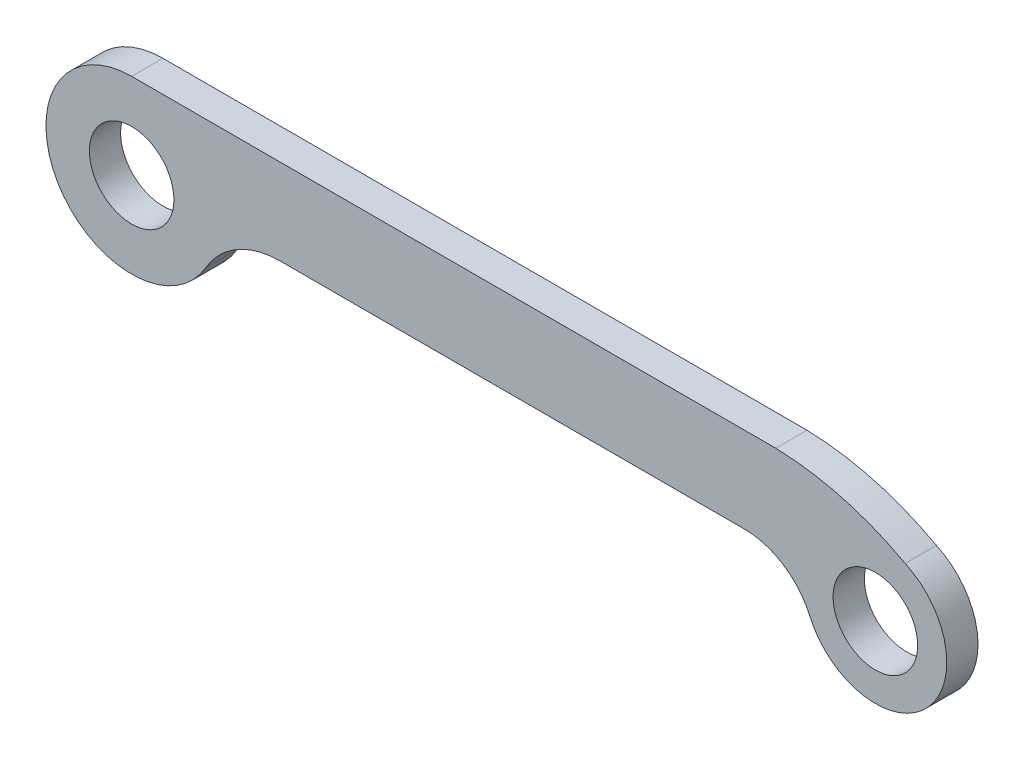
ISO-10303-21;
HEADER;
FILE_DESCRIPTION(('STEP AP214'),'2;1');
FILE_NAME('part.step','',(''),(''),'','','');
FILE_SCHEMA(('AUTOMOTIVE_DESIGN { 1 0 10303 214 1 1 1 1 }'));
ENDSEC;
DATA;
#1=APPLICATION_CONTEXT('core data for automotive mechanical design processes');
#2=APPLICATION_PROTOCOL_DEFINITION('international standard','automotive_design',2000,#1);
#3=PRODUCT_CONTEXT('',#1,'mechanical');
#4=PRODUCT('Part','Part','',(#3));
#5=PRODUCT_RELATED_PRODUCT_CATEGORY('part','',(#4));
#6=PRODUCT_DEFINITION_FORMATION('','',#4);
#7=PRODUCT_DEFINITION_CONTEXT('part definition',#1,'design');
#8=PRODUCT_DEFINITION('design','',#6,#7);
#9=PRODUCT_DEFINITION_SHAPE('','',#8);
#10=(LENGTH_UNIT() NAMED_UNIT(*) SI_UNIT(.MILLI.,.METRE.));
#11=(NAMED_UNIT(*) PLANE_ANGLE_UNIT() SI_UNIT($,.RADIAN.));
#12=(NAMED_UNIT(*) SI_UNIT($,.STERADIAN.) SOLID_ANGLE_UNIT());
#13=UNCERTAINTY_MEASURE_WITH_UNIT(LENGTH_MEASURE(1.E-05),#10,'distance_accuracy_value','');
#14=(GEOMETRIC_REPRESENTATION_CONTEXT(3) GLOBAL_UNCERTAINTY_ASSIGNED_CONTEXT((#13)) GLOBAL_UNIT_ASSIGNED_CONTEXT((#10,
#11,#12)) REPRESENTATION_CONTEXT('',''));
#15=CARTESIAN_POINT('',(0.,0.,0.));
#16=DIRECTION('',(0.,0.,1.));
#17=DIRECTION('',(1.,0.,0.));
#18=AXIS2_PLACEMENT_3D('',#15,#16,#17);
#19=CARTESIAN_POINT('',(33.2553755053223,-19.2,7.));
#20=DIRECTION('',(0.,0.,-1.));
#21=DIRECTION('',(-1.,0.,0.));
#22=AXIS2_PLACEMENT_3D('',#19,#20,#21);
#23=CYLINDRICAL_SURFACE('',#22,19.2);
#24=CARTESIAN_POINT('',(33.2553755053223,-19.2,0.));
#25=DIRECTION('',(0.,0.,1.));
#26=DIRECTION('',(1.,0.,0.));
#27=AXIS2_PLACEMENT_3D('',#24,#25,#26);
#28=CIRCLE('',#27,19.2);
#29=CARTESIAN_POINT('',(33.2553755053223,0.,0.));
#30=VERTEX_POINT('',#29);
#31=CARTESIAN_POINT('',(16.6276877526612,-9.60000000000002,0.));
#32=VERTEX_POINT('',#31);
#33=EDGE_CURVE('E148',#30,#32,#28,.T.);
#34=ORIENTED_EDGE('',*,*,#33,.F.);
#35=DIRECTION('',(0.,0.,-1.));
#36=VECTOR('',#35,1.);
#37=CARTESIAN_POINT('',(33.2553755053223,0.,7.));
#38=LINE('',#37,#36);
#39=CARTESIAN_POINT('',(33.2553755053223,0.,7.));
#40=VERTEX_POINT('',#39);
#41=EDGE_CURVE('E11',#40,#30,#38,.T.);
#42=ORIENTED_EDGE('',*,*,#41,.F.);
#43=CARTESIAN_POINT('',(33.2553755053223,-19.2,7.));
#44=DIRECTION('',(0.,0.,1.));
#45=DIRECTION('',(1.,0.,0.));
#46=AXIS2_PLACEMENT_3D('',#43,#44,#45);
#47=CIRCLE('',#46,19.2);
#48=CARTESIAN_POINT('',(16.6276877526612,-9.60000000000002,7.));
#49=VERTEX_POINT('',#48);
#50=EDGE_CURVE('E177',#40,#49,#47,.T.);
#51=ORIENTED_EDGE('',*,*,#50,.T.);
#52=DIRECTION('',(0.,0.,-1.));
#53=VECTOR('',#52,1.);
#54=CARTESIAN_POINT('',(16.6276877526612,-9.60000000000002,7.));
#55=LINE('',#54,#53);
#56=EDGE_CURVE('E91',#49,#32,#55,.T.);
#57=ORIENTED_EDGE('',*,*,#56,.T.);
#58=EDGE_LOOP('',(#34,#42,#51,#57));
#59=FACE_BOUND('',#58,.T.);
#60=ADVANCED_FACE('F44',(#59),#23,.F.);
#61=CARTESIAN_POINT('',(0.,0.,7.));
#62=DIRECTION('',(0.,1.,0.));
#63=DIRECTION('',(-1.,0.,0.));
#64=AXIS2_PLACEMENT_3D('',#61,#62,#63);
#65=PLANE('',#64);
#66=DIRECTION('',(1.,0.,0.));
#67=VECTOR('',#66,1.);
#68=CARTESIAN_POINT('',(0.,0.,0.));
#69=LINE('',#68,#67);
#70=CARTESIAN_POINT('',(137.31626294448,0.,0.));
#71=VERTEX_POINT('',#70);
#72=EDGE_CURVE('E147',#30,#71,#69,.T.);
#73=ORIENTED_EDGE('',*,*,#72,.T.);
#74=DIRECTION('',(0.,0.,-1.));
#75=VECTOR('',#74,1.);
#76=CARTESIAN_POINT('',(137.31626294448,0.,7.));
#77=LINE('',#76,#75);
#78=CARTESIAN_POINT('',(137.31626294448,0.,7.));
#79=VERTEX_POINT('',#78);
#80=EDGE_CURVE('E53',#79,#71,#77,.T.);
#81=ORIENTED_EDGE('',*,*,#80,.F.);
#82=DIRECTION('',(1.,0.,0.));
#83=VECTOR('',#82,1.);
#84=CARTESIAN_POINT('',(0.,0.,7.));
#85=LINE('',#84,#83);
#86=EDGE_CURVE('E202',#40,#79,#85,.T.);
#87=ORIENTED_EDGE('',*,*,#86,.F.);
#88=ORIENTED_EDGE('',*,*,#41,.T.);
#89=EDGE_LOOP('',(#73,#81,#87,#88));
#90=FACE_BOUND('',#89,.T.);
#91=ADVANCED_FACE('F211',(#90),#65,.F.);
#92=CARTESIAN_POINT('',(137.31626294448,-16.,7.));
#93=DIRECTION('',(0.,0.,-1.));
#94=DIRECTION('',(-1.,0.,0.));
#95=AXIS2_PLACEMENT_3D('',#92,#93,#94);
#96=CYLINDRICAL_SURFACE('',#95,16.);
#97=CARTESIAN_POINT('',(137.31626294448,-16.,0.));
#98=DIRECTION('',(0.,0.,1.));
#99=DIRECTION('',(1.,0.,0.));
#100=AXIS2_PLACEMENT_3D('',#97,#98,#99);
#101=CIRCLE('',#100,16.);
#102=CARTESIAN_POINT('',(151.980376503408,-9.5997051996922,0.));
#103=VERTEX_POINT('',#102);
#104=EDGE_CURVE('E153',#71,#103,#101,.F.);
#105=ORIENTED_EDGE('',*,*,#104,.T.);
#106=DIRECTION('',(0.,0.,-1.));
#107=VECTOR('',#106,1.);
#108=CARTESIAN_POINT('',(151.980376503408,-9.5997051996922,7.));
#109=LINE('',#108,#107);
#110=CARTESIAN_POINT('',(151.980376503408,-9.5997051996922,7.));
#111=VERTEX_POINT('',#110);
#112=EDGE_CURVE('E181',#111,#103,#109,.T.);
#113=ORIENTED_EDGE('',*,*,#112,.F.);
#114=CARTESIAN_POINT('',(137.31626294448,-16.,7.));
#115=DIRECTION('',(0.,0.,1.));
#116=DIRECTION('',(1.,0.,0.));
#117=AXIS2_PLACEMENT_3D('',#114,#115,#116);
#118=CIRCLE('',#117,16.);
#119=EDGE_CURVE('E191',#79,#111,#118,.F.);
#120=ORIENTED_EDGE('',*,*,#119,.F.);
#121=ORIENTED_EDGE('',*,*,#80,.T.);
#122=EDGE_LOOP('',(#105,#113,#120,#121));
#123=FACE_BOUND('',#122,.T.);
#124=ADVANCED_FACE('F195',(#123),#96,.F.);
#125=CARTESIAN_POINT('',(166.644490062337,-3.19941039938443,7.));
#126=DIRECTION('',(0.,0.,-1.));
#127=DIRECTION('',(-1.,0.,0.));
#128=AXIS2_PLACEMENT_3D('',#125,#126,#127);
#129=CYLINDRICAL_SURFACE('',#128,16.);
#130=CARTESIAN_POINT('',(166.644490062337,-3.19941039938443,0.));
#131=DIRECTION('',(0.,0.,1.));
#132=DIRECTION('',(1.,0.,0.));
#133=AXIS2_PLACEMENT_3D('',#130,#131,#132);
#134=CIRCLE('',#133,16.);
#135=CARTESIAN_POINT('',(173.328738351677,11.3374676975956,0.));
#136=VERTEX_POINT('',#135);
#137=EDGE_CURVE('E156',#103,#136,#134,.T.);
#138=ORIENTED_EDGE('',*,*,#137,.T.);
#139=DIRECTION('',(0.,0.,-1.));
#140=VECTOR('',#139,1.);
#141=CARTESIAN_POINT('',(173.328738351677,11.3374676975956,7.));
#142=LINE('',#141,#140);
#143=CARTESIAN_POINT('',(173.328738351677,11.3374676975956,7.));
#144=VERTEX_POINT('',#143);
#145=EDGE_CURVE('E122',#144,#136,#142,.T.);
#146=ORIENTED_EDGE('',*,*,#145,.F.);
#147=CARTESIAN_POINT('',(166.644490062337,-3.19941039938443,7.));
#148=DIRECTION('',(0.,0.,1.));
#149=DIRECTION('',(1.,0.,0.));
#150=AXIS2_PLACEMENT_3D('',#147,#148,#149);
#151=CIRCLE('',#150,16.);
#152=EDGE_CURVE('E130',#111,#144,#151,.T.);
#153=ORIENTED_EDGE('',*,*,#152,.F.);
#154=ORIENTED_EDGE('',*,*,#112,.T.);
#155=EDGE_LOOP('',(#138,#146,#153,#154));
#156=FACE_BOUND('',#155,.T.);
#157=ADVANCED_FACE('F205',(#156),#129,.T.);
#158=CARTESIAN_POINT('',(142.532840486075,-44.8343295314916,7.));
#159=DIRECTION('',(0.,0.,-1.));
#160=DIRECTION('',(-1.,0.,0.));
#161=AXIS2_PLACEMENT_3D('',#158,#159,#160);
#162=CYLINDRICAL_SURFACE('',#161,64.0598011961814);
#163=CARTESIAN_POINT('',(142.532840486075,-44.8343295314916,0.));
#164=DIRECTION('',(0.,0.,1.));
#165=DIRECTION('',(1.,0.,0.));
#166=AXIS2_PLACEMENT_3D('',#163,#164,#165);
#167=CIRCLE('',#166,64.0598011961814);
#168=CARTESIAN_POINT('',(144.339154618949,19.2,0.));
#169=VERTEX_POINT('',#168);
#170=EDGE_CURVE('E113',#169,#136,#167,.F.);
#171=ORIENTED_EDGE('',*,*,#170,.F.);
#172=DIRECTION('',(0.,0.,-1.));
#173=VECTOR('',#172,1.);
#174=CARTESIAN_POINT('',(144.339154618949,19.2,7.));
#175=LINE('',#174,#173);
#176=CARTESIAN_POINT('',(144.339154618949,19.2,7.));
#177=VERTEX_POINT('',#176);
#178=EDGE_CURVE('E109',#177,#169,#175,.T.);
#179=ORIENTED_EDGE('',*,*,#178,.F.);
#180=CARTESIAN_POINT('',(142.532840486075,-44.8343295314916,7.));
#181=DIRECTION('',(0.,0.,1.));
#182=DIRECTION('',(1.,0.,0.));
#183=AXIS2_PLACEMENT_3D('',#180,#181,#182);
#184=CIRCLE('',#183,64.0598011961814);
#185=EDGE_CURVE('E114',#177,#144,#184,.F.);
#186=ORIENTED_EDGE('',*,*,#185,.T.);
#187=ORIENTED_EDGE('',*,*,#145,.T.);
#188=EDGE_LOOP('',(#171,#179,#186,#187));
#189=FACE_BOUND('',#188,.T.);
#190=ADVANCED_FACE('F115',(#189),#162,.T.);
#191=CARTESIAN_POINT('',(0.,19.2,7.));
#192=DIRECTION('',(0.,1.,0.));
#193=DIRECTION('',(-1.,0.,0.));
#194=AXIS2_PLACEMENT_3D('',#191,#192,#193);
#195=PLANE('',#194);
#196=DIRECTION('',(1.,0.,0.));
#197=VECTOR('',#196,1.);
#198=CARTESIAN_POINT('',(0.,19.2,0.));
#199=LINE('',#198,#197);
#200=CARTESIAN_POINT('',(0.,19.2,0.));
#201=VERTEX_POINT('',#200);
#202=EDGE_CURVE('E165',#201,#169,#199,.T.);
#203=ORIENTED_EDGE('',*,*,#202,.F.);
#204=DIRECTION('',(0.,0.,-1.));
#205=VECTOR('',#204,1.);
#206=CARTESIAN_POINT('',(0.,19.2,7.));
#207=LINE('',#206,#205);
#208=CARTESIAN_POINT('',(0.,19.2,7.));
#209=VERTEX_POINT('',#208);
#210=EDGE_CURVE('E88',#209,#201,#207,.T.);
#211=ORIENTED_EDGE('',*,*,#210,.F.);
#212=DIRECTION('',(1.,0.,0.));
#213=VECTOR('',#212,1.);
#214=CARTESIAN_POINT('',(0.,19.2,7.));
#215=LINE('',#214,#213);
#216=EDGE_CURVE('E123',#209,#177,#215,.T.);
#217=ORIENTED_EDGE('',*,*,#216,.T.);
#218=ORIENTED_EDGE('',*,*,#178,.T.);
#219=EDGE_LOOP('',(#203,#211,#217,#218));
#220=FACE_BOUND('',#219,.T.);
#221=ADVANCED_FACE('F134',(#220),#195,.T.);
#222=CARTESIAN_POINT('',(0.,0.,7.));
#223=DIRECTION('',(0.,0.,-1.));
#224=DIRECTION('',(-1.,0.,0.));
#225=AXIS2_PLACEMENT_3D('',#222,#223,#224);
#226=CYLINDRICAL_SURFACE('',#225,9.47199999999998);
#227=CARTESIAN_POINT('',(0.,0.,7.));
#228=DIRECTION('',(0.,0.,1.));
#229=DIRECTION('',(1.,0.,0.));
#230=AXIS2_PLACEMENT_3D('',#227,#228,#229);
#231=CIRCLE('',#230,9.47199999999998);
#232=CARTESIAN_POINT('',(9.47199999999998,0.,7.));
#233=VERTEX_POINT('',#232);
#234=EDGE_CURVE('E132',#233,#233,#231,.T.);
#235=ORIENTED_EDGE('',*,*,#234,.T.);
#236=EDGE_LOOP('',(#235));
#237=FACE_BOUND('',#236,.T.);
#238=CARTESIAN_POINT('',(0.,0.,0.));
#239=DIRECTION('',(0.,0.,1.));
#240=DIRECTION('',(1.,0.,0.));
#241=AXIS2_PLACEMENT_3D('',#238,#239,#240);
#242=CIRCLE('',#241,9.47199999999998);
#243=CARTESIAN_POINT('',(9.47199999999998,0.,0.));
#244=VERTEX_POINT('',#243);
#245=EDGE_CURVE('E169',#244,#244,#242,.T.);
#246=ORIENTED_EDGE('',*,*,#245,.F.);
#247=EDGE_LOOP('',(#246));
#248=FACE_BOUND('',#247,.T.);
#249=ADVANCED_FACE('F223',(#237,#248),#226,.F.);
#250=CARTESIAN_POINT('',(0.,0.,7.));
#251=DIRECTION('',(0.,0.,-1.));
#252=DIRECTION('',(-1.,0.,0.));
#253=AXIS2_PLACEMENT_3D('',#250,#251,#252);
#254=CYLINDRICAL_SURFACE('',#253,19.2);
#255=CARTESIAN_POINT('',(0.,0.,0.));
#256=DIRECTION('',(0.,0.,1.));
#257=DIRECTION('',(1.,0.,0.));
#258=AXIS2_PLACEMENT_3D('',#255,#256,#257);
#259=CIRCLE('',#258,19.2);
#260=EDGE_CURVE('E164',#201,#32,#259,.T.);
#261=ORIENTED_EDGE('',*,*,#260,.T.);
#262=ORIENTED_EDGE('',*,*,#56,.F.);
#263=CARTESIAN_POINT('',(0.,0.,7.));
#264=DIRECTION('',(0.,0.,1.));
#265=DIRECTION('',(1.,0.,0.));
#266=AXIS2_PLACEMENT_3D('',#263,#264,#265);
#267=CIRCLE('',#266,19.2);
#268=EDGE_CURVE('E61',#209,#49,#267,.T.);
#269=ORIENTED_EDGE('',*,*,#268,.F.);
#270=ORIENTED_EDGE('',*,*,#210,.T.);
#271=EDGE_LOOP('',(#261,#262,#269,#270));
#272=FACE_BOUND('',#271,.T.);
#273=ADVANCED_FACE('F229',(#272),#254,.T.);
#274=CARTESIAN_POINT('',(166.644490062337,-3.19941039938443,7.));
#275=DIRECTION('',(0.,0.,-1.));
#276=DIRECTION('',(-1.,0.,0.));
#277=AXIS2_PLACEMENT_3D('',#274,#275,#276);
#278=CYLINDRICAL_SURFACE('',#277,9.47200000000001);
#279=CARTESIAN_POINT('',(166.644490062337,-3.19941039938443,7.));
#280=DIRECTION('',(0.,0.,1.));
#281=DIRECTION('',(1.,0.,0.));
#282=AXIS2_PLACEMENT_3D('',#279,#280,#281);
#283=CIRCLE('',#282,9.47200000000001);
#284=CARTESIAN_POINT('',(176.116490062337,-3.19941039938443,7.));
#285=VERTEX_POINT('',#284);
#286=EDGE_CURVE('E142',#285,#285,#283,.T.);
#287=ORIENTED_EDGE('',*,*,#286,.T.);
#288=EDGE_LOOP('',(#287));
#289=FACE_BOUND('',#288,.T.);
#290=CARTESIAN_POINT('',(166.644490062337,-3.19941039938443,0.));
#291=DIRECTION('',(0.,0.,1.));
#292=DIRECTION('',(1.,0.,0.));
#293=AXIS2_PLACEMENT_3D('',#290,#291,#292);
#294=CIRCLE('',#293,9.47200000000001);
#295=CARTESIAN_POINT('',(176.116490062337,-3.19941039938443,0.));
#296=VERTEX_POINT('',#295);
#297=EDGE_CURVE('E171',#296,#296,#294,.T.);
#298=ORIENTED_EDGE('',*,*,#297,.F.);
#299=EDGE_LOOP('',(#298));
#300=FACE_BOUND('',#299,.T.);
#301=ADVANCED_FACE('F228',(#289,#300),#278,.F.);
#302=CARTESIAN_POINT('',(0.,0.,7.));
#303=DIRECTION('',(0.,0.,1.));
#304=DIRECTION('',(1.,0.,0.));
#305=AXIS2_PLACEMENT_3D('',#302,#303,#304);
#306=PLANE('',#305);
#307=ORIENTED_EDGE('',*,*,#50,.F.);
#308=ORIENTED_EDGE('',*,*,#86,.T.);
#309=ORIENTED_EDGE('',*,*,#119,.T.);
#310=ORIENTED_EDGE('',*,*,#152,.T.);
#311=ORIENTED_EDGE('',*,*,#185,.F.);
#312=ORIENTED_EDGE('',*,*,#216,.F.);
#313=ORIENTED_EDGE('',*,*,#268,.T.);
#314=EDGE_LOOP('',(#307,#308,#309,#310,#311,#312,#313));
#315=FACE_BOUND('',#314,.T.);
#316=ORIENTED_EDGE('',*,*,#234,.F.);
#317=EDGE_LOOP('',(#316));
#318=FACE_BOUND('',#317,.T.);
#319=ORIENTED_EDGE('',*,*,#286,.F.);
#320=EDGE_LOOP('',(#319));
#321=FACE_BOUND('',#320,.T.);
#322=ADVANCED_FACE('F124',(#315,#318,#321),#306,.T.);
#323=CARTESIAN_POINT('',(0.,0.,0.));
#324=DIRECTION('',(0.,0.,1.));
#325=DIRECTION('',(1.,0.,0.));
#326=AXIS2_PLACEMENT_3D('',#323,#324,#325);
#327=PLANE('',#326);
#328=ORIENTED_EDGE('',*,*,#33,.T.);
#329=ORIENTED_EDGE('',*,*,#260,.F.);
#330=ORIENTED_EDGE('',*,*,#202,.T.);
#331=ORIENTED_EDGE('',*,*,#170,.T.);
#332=ORIENTED_EDGE('',*,*,#137,.F.);
#333=ORIENTED_EDGE('',*,*,#104,.F.);
#334=ORIENTED_EDGE('',*,*,#72,.F.);
#335=EDGE_LOOP('',(#328,#329,#330,#331,#332,#333,#334));
#336=FACE_BOUND('',#335,.T.);
#337=ORIENTED_EDGE('',*,*,#245,.T.);
#338=EDGE_LOOP('',(#337));
#339=FACE_BOUND('',#338,.T.);
#340=ORIENTED_EDGE('',*,*,#297,.T.);
#341=EDGE_LOOP('',(#340));
#342=FACE_BOUND('',#341,.T.);
#343=ADVANCED_FACE('F200',(#336,#339,#342),#327,.F.);
#344=CLOSED_SHELL('',(#60,#91,#124,#157,#190,#221,#249,#273,#301,#322,#343));
#345=MANIFOLD_SOLID_BREP('B2',#344);
#346=ADVANCED_BREP_SHAPE_REPRESENTATION('',(#18,#345),#14);
#347=SHAPE_DEFINITION_REPRESENTATION(#9,#346);
ENDSEC;
END-ISO-10303-21;
